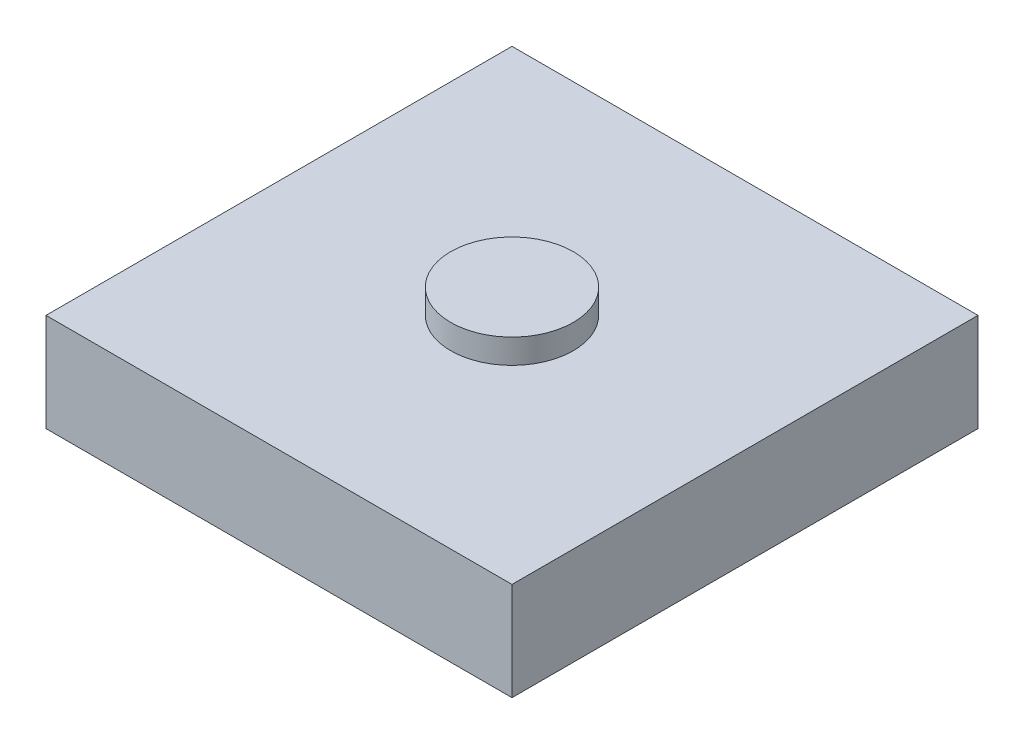
ISO-10303-21;
HEADER;
FILE_DESCRIPTION(('STEP AP214'),'2;1');
FILE_NAME('part.step','',(''),(''),'','','');
FILE_SCHEMA(('AUTOMOTIVE_DESIGN { 1 0 10303 214 1 1 1 1 }'));
ENDSEC;
DATA;
#1=APPLICATION_CONTEXT('core data for automotive mechanical design processes');
#2=APPLICATION_PROTOCOL_DEFINITION('international standard','automotive_design',2000,#1);
#3=PRODUCT_CONTEXT('',#1,'mechanical');
#4=PRODUCT('Part','Part','',(#3));
#5=PRODUCT_RELATED_PRODUCT_CATEGORY('part','',(#4));
#6=PRODUCT_DEFINITION_FORMATION('','',#4);
#7=PRODUCT_DEFINITION_CONTEXT('part definition',#1,'design');
#8=PRODUCT_DEFINITION('design','',#6,#7);
#9=PRODUCT_DEFINITION_SHAPE('','',#8);
#10=(LENGTH_UNIT() NAMED_UNIT(*) SI_UNIT(.MILLI.,.METRE.));
#11=(NAMED_UNIT(*) PLANE_ANGLE_UNIT() SI_UNIT($,.RADIAN.));
#12=(NAMED_UNIT(*) SI_UNIT($,.STERADIAN.) SOLID_ANGLE_UNIT());
#13=UNCERTAINTY_MEASURE_WITH_UNIT(LENGTH_MEASURE(1.E-05),#10,'distance_accuracy_value','');
#14=(GEOMETRIC_REPRESENTATION_CONTEXT(3) GLOBAL_UNCERTAINTY_ASSIGNED_CONTEXT((#13)) GLOBAL_UNIT_ASSIGNED_CONTEXT((#10,
#11,#12)) REPRESENTATION_CONTEXT('',''));
#15=CARTESIAN_POINT('',(0.,0.,0.));
#16=DIRECTION('',(0.,0.,1.));
#17=DIRECTION('',(1.,0.,0.));
#18=AXIS2_PLACEMENT_3D('',#15,#16,#17);
#19=CARTESIAN_POINT('',(12.065,5.08,12.065));
#20=DIRECTION('',(-1.,0.,0.));
#21=DIRECTION('',(0.,0.,1.));
#22=AXIS2_PLACEMENT_3D('',#19,#20,#21);
#23=PLANE('',#22);
#24=DIRECTION('',(0.,0.,-1.));
#25=VECTOR('',#24,1.);
#26=CARTESIAN_POINT('',(12.065,0.,12.065));
#27=LINE('',#26,#25);
#28=CARTESIAN_POINT('',(12.065,0.,12.065));
#29=VERTEX_POINT('',#28);
#30=CARTESIAN_POINT('',(12.065,0.,-12.065));
#31=VERTEX_POINT('',#30);
#32=EDGE_CURVE('E99',#29,#31,#27,.T.);
#33=ORIENTED_EDGE('',*,*,#32,.T.);
#34=DIRECTION('',(0.,-1.,0.));
#35=VECTOR('',#34,1.);
#36=CARTESIAN_POINT('',(12.065,5.08,-12.065));
#37=LINE('',#36,#35);
#38=CARTESIAN_POINT('',(12.065,5.08,-12.065));
#39=VERTEX_POINT('',#38);
#40=EDGE_CURVE('E41',#39,#31,#37,.T.);
#41=ORIENTED_EDGE('',*,*,#40,.F.);
#42=DIRECTION('',(0.,0.,-1.));
#43=VECTOR('',#42,1.);
#44=CARTESIAN_POINT('',(12.065,5.08,12.065));
#45=LINE('',#44,#43);
#46=CARTESIAN_POINT('',(12.065,5.08,12.065));
#47=VERTEX_POINT('',#46);
#48=EDGE_CURVE('E85',#47,#39,#45,.T.);
#49=ORIENTED_EDGE('',*,*,#48,.F.);
#50=DIRECTION('',(0.,-1.,0.));
#51=VECTOR('',#50,1.);
#52=CARTESIAN_POINT('',(12.065,5.08,12.065));
#53=LINE('',#52,#51);
#54=EDGE_CURVE('E95',#47,#29,#53,.T.);
#55=ORIENTED_EDGE('',*,*,#54,.T.);
#56=EDGE_LOOP('',(#33,#41,#49,#55));
#57=FACE_BOUND('',#56,.T.);
#58=ADVANCED_FACE('F33',(#57),#23,.F.);
#59=CARTESIAN_POINT('',(-12.065,5.08,-12.065));
#60=DIRECTION('',(0.,0.,1.));
#61=DIRECTION('',(1.,0.,0.));
#62=AXIS2_PLACEMENT_3D('',#59,#60,#61);
#63=PLANE('',#62);
#64=DIRECTION('',(-1.,0.,0.));
#65=VECTOR('',#64,1.);
#66=CARTESIAN_POINT('',(-12.065,0.,-12.065));
#67=LINE('',#66,#65);
#68=CARTESIAN_POINT('',(-12.065,0.,-12.065));
#69=VERTEX_POINT('',#68);
#70=EDGE_CURVE('E90',#31,#69,#67,.T.);
#71=ORIENTED_EDGE('',*,*,#70,.T.);
#72=DIRECTION('',(0.,-1.,0.));
#73=VECTOR('',#72,1.);
#74=CARTESIAN_POINT('',(-12.065,5.08,-12.065));
#75=LINE('',#74,#73);
#76=CARTESIAN_POINT('',(-12.065,5.08,-12.065));
#77=VERTEX_POINT('',#76);
#78=EDGE_CURVE('E88',#77,#69,#75,.T.);
#79=ORIENTED_EDGE('',*,*,#78,.F.);
#80=DIRECTION('',(-1.,0.,0.));
#81=VECTOR('',#80,1.);
#82=CARTESIAN_POINT('',(-12.065,5.08,-12.065));
#83=LINE('',#82,#81);
#84=EDGE_CURVE('E80',#39,#77,#83,.T.);
#85=ORIENTED_EDGE('',*,*,#84,.F.);
#86=ORIENTED_EDGE('',*,*,#40,.T.);
#87=EDGE_LOOP('',(#71,#79,#85,#86));
#88=FACE_BOUND('',#87,.T.);
#89=ADVANCED_FACE('F89',(#88),#63,.F.);
#90=CARTESIAN_POINT('',(-12.065,5.08,12.065));
#91=DIRECTION('',(1.,0.,0.));
#92=DIRECTION('',(0.,0.,-1.));
#93=AXIS2_PLACEMENT_3D('',#90,#91,#92);
#94=PLANE('',#93);
#95=DIRECTION('',(0.,0.,1.));
#96=VECTOR('',#95,1.);
#97=CARTESIAN_POINT('',(-12.065,0.,12.065));
#98=LINE('',#97,#96);
#99=CARTESIAN_POINT('',(-12.065,0.,12.065));
#100=VERTEX_POINT('',#99);
#101=EDGE_CURVE('E66',#69,#100,#98,.T.);
#102=ORIENTED_EDGE('',*,*,#101,.T.);
#103=DIRECTION('',(0.,-1.,0.));
#104=VECTOR('',#103,1.);
#105=CARTESIAN_POINT('',(-12.065,5.08,12.065));
#106=LINE('',#105,#104);
#107=CARTESIAN_POINT('',(-12.065,5.08,12.065));
#108=VERTEX_POINT('',#107);
#109=EDGE_CURVE('E91',#108,#100,#106,.T.);
#110=ORIENTED_EDGE('',*,*,#109,.F.);
#111=DIRECTION('',(0.,0.,1.));
#112=VECTOR('',#111,1.);
#113=CARTESIAN_POINT('',(-12.065,5.08,12.065));
#114=LINE('',#113,#112);
#115=EDGE_CURVE('E83',#77,#108,#114,.T.);
#116=ORIENTED_EDGE('',*,*,#115,.F.);
#117=ORIENTED_EDGE('',*,*,#78,.T.);
#118=EDGE_LOOP('',(#102,#110,#116,#117));
#119=FACE_BOUND('',#118,.T.);
#120=ADVANCED_FACE('F93',(#119),#94,.F.);
#121=CARTESIAN_POINT('',(-12.065,5.08,12.065));
#122=DIRECTION('',(0.,0.,-1.));
#123=DIRECTION('',(-1.,0.,0.));
#124=AXIS2_PLACEMENT_3D('',#121,#122,#123);
#125=PLANE('',#124);
#126=DIRECTION('',(1.,0.,0.));
#127=VECTOR('',#126,1.);
#128=CARTESIAN_POINT('',(-12.065,0.,12.065));
#129=LINE('',#128,#127);
#130=EDGE_CURVE('E72',#100,#29,#129,.T.);
#131=ORIENTED_EDGE('',*,*,#130,.T.);
#132=ORIENTED_EDGE('',*,*,#54,.F.);
#133=DIRECTION('',(1.,0.,0.));
#134=VECTOR('',#133,1.);
#135=CARTESIAN_POINT('',(-12.065,5.08,12.065));
#136=LINE('',#135,#134);
#137=EDGE_CURVE('E49',#108,#47,#136,.T.);
#138=ORIENTED_EDGE('',*,*,#137,.F.);
#139=ORIENTED_EDGE('',*,*,#109,.T.);
#140=EDGE_LOOP('',(#131,#132,#138,#139));
#141=FACE_BOUND('',#140,.T.);
#142=ADVANCED_FACE('F122',(#141),#125,.F.);
#143=CARTESIAN_POINT('',(0.,5.08,0.));
#144=DIRECTION('',(0.,-1.,0.));
#145=DIRECTION('',(0.,0.,-1.));
#146=AXIS2_PLACEMENT_3D('',#143,#144,#145);
#147=PLANE('',#146);
#148=CARTESIAN_POINT('',(0.,5.08,0.));
#149=DIRECTION('',(0.,-1.,0.));
#150=DIRECTION('',(0.,0.,-1.));
#151=AXIS2_PLACEMENT_3D('',#148,#149,#150);
#152=CIRCLE('',#151,3.175);
#153=CARTESIAN_POINT('',(0.,5.08,-3.175));
#154=VERTEX_POINT('',#153);
#155=EDGE_CURVE('E11',#154,#154,#152,.F.);
#156=ORIENTED_EDGE('',*,*,#155,.F.);
#157=EDGE_LOOP('',(#156));
#158=FACE_BOUND('',#157,.T.);
#159=ORIENTED_EDGE('',*,*,#48,.T.);
#160=ORIENTED_EDGE('',*,*,#84,.T.);
#161=ORIENTED_EDGE('',*,*,#115,.T.);
#162=ORIENTED_EDGE('',*,*,#137,.T.);
#163=EDGE_LOOP('',(#159,#160,#161,#162));
#164=FACE_BOUND('',#163,.T.);
#165=ADVANCED_FACE('F81',(#158,#164),#147,.F.);
#166=CARTESIAN_POINT('',(0.,0.,0.));
#167=DIRECTION('',(0.,-1.,0.));
#168=DIRECTION('',(0.,0.,-1.));
#169=AXIS2_PLACEMENT_3D('',#166,#167,#168);
#170=PLANE('',#169);
#171=CARTESIAN_POINT('',(0.,0.,0.));
#172=DIRECTION('',(0.,1.,0.));
#173=DIRECTION('',(0.,0.,1.));
#174=AXIS2_PLACEMENT_3D('',#171,#172,#173);
#175=CIRCLE('',#174,3.302);
#176=CARTESIAN_POINT('',(0.,0.,3.302));
#177=VERTEX_POINT('',#176);
#178=EDGE_CURVE('E180',#177,#177,#175,.T.);
#179=ORIENTED_EDGE('',*,*,#178,.T.);
#180=EDGE_LOOP('',(#179));
#181=FACE_BOUND('',#180,.T.);
#182=ORIENTED_EDGE('',*,*,#32,.F.);
#183=ORIENTED_EDGE('',*,*,#130,.F.);
#184=ORIENTED_EDGE('',*,*,#101,.F.);
#185=ORIENTED_EDGE('',*,*,#70,.F.);
#186=EDGE_LOOP('',(#182,#183,#184,#185));
#187=FACE_BOUND('',#186,.T.);
#188=ADVANCED_FACE('F110',(#181,#187),#170,.T.);
#189=CARTESIAN_POINT('',(0.,1.27,0.));
#190=DIRECTION('',(0.,-1.,0.));
#191=DIRECTION('',(0.,0.,-1.));
#192=AXIS2_PLACEMENT_3D('',#189,#190,#191);
#193=CYLINDRICAL_SURFACE('',#192,3.302);
#194=CARTESIAN_POINT('',(0.,1.27,0.));
#195=DIRECTION('',(0.,1.,0.));
#196=DIRECTION('',(0.,0.,1.));
#197=AXIS2_PLACEMENT_3D('',#194,#195,#196);
#198=CIRCLE('',#197,3.302);
#199=CARTESIAN_POINT('',(0.,1.27,3.302));
#200=VERTEX_POINT('',#199);
#201=EDGE_CURVE('E102',#200,#200,#198,.T.);
#202=ORIENTED_EDGE('',*,*,#201,.T.);
#203=EDGE_LOOP('',(#202));
#204=FACE_BOUND('',#203,.T.);
#205=ORIENTED_EDGE('',*,*,#178,.F.);
#206=EDGE_LOOP('',(#205));
#207=FACE_BOUND('',#206,.T.);
#208=ADVANCED_FACE('F112',(#204,#207),#193,.F.);
#209=CARTESIAN_POINT('',(0.,1.27,0.));
#210=DIRECTION('',(0.,1.,0.));
#211=DIRECTION('',(0.,0.,1.));
#212=AXIS2_PLACEMENT_3D('',#209,#210,#211);
#213=PLANE('',#212);
#214=ORIENTED_EDGE('',*,*,#201,.F.);
#215=EDGE_LOOP('',(#214));
#216=FACE_BOUND('',#215,.T.);
#217=ADVANCED_FACE('F119',(#216),#213,.F.);
#218=CARTESIAN_POINT('',(0.,6.35,0.));
#219=DIRECTION('',(0.,-1.,0.));
#220=DIRECTION('',(0.,0.,-1.));
#221=AXIS2_PLACEMENT_3D('',#218,#219,#220);
#222=CYLINDRICAL_SURFACE('',#221,3.175);
#223=CARTESIAN_POINT('',(0.,6.35,0.));
#224=DIRECTION('',(0.,1.,0.));
#225=DIRECTION('',(0.,0.,1.));
#226=AXIS2_PLACEMENT_3D('',#223,#224,#225);
#227=CIRCLE('',#226,3.175);
#228=CARTESIAN_POINT('',(0.,6.35,3.175));
#229=VERTEX_POINT('',#228);
#230=EDGE_CURVE('E182',#229,#229,#227,.T.);
#231=ORIENTED_EDGE('',*,*,#230,.F.);
#232=EDGE_LOOP('',(#231));
#233=FACE_BOUND('',#232,.T.);
#234=ORIENTED_EDGE('',*,*,#155,.T.);
#235=EDGE_LOOP('',(#234));
#236=FACE_BOUND('',#235,.T.);
#237=ADVANCED_FACE('F155',(#233,#236),#222,.T.);
#238=CARTESIAN_POINT('',(0.,6.35,0.));
#239=DIRECTION('',(0.,1.,0.));
#240=DIRECTION('',(0.,0.,1.));
#241=AXIS2_PLACEMENT_3D('',#238,#239,#240);
#242=PLANE('',#241);
#243=ORIENTED_EDGE('',*,*,#230,.T.);
#244=EDGE_LOOP('',(#243));
#245=FACE_BOUND('',#244,.T.);
#246=ADVANCED_FACE('F160',(#245),#242,.T.);
#247=CLOSED_SHELL('',(#58,#89,#120,#142,#165,#188,#208,#217,#237,#246));
#248=MANIFOLD_SOLID_BREP('B2',#247);
#249=ADVANCED_BREP_SHAPE_REPRESENTATION('',(#18,#248),#14);
#250=SHAPE_DEFINITION_REPRESENTATION(#9,#249);
ENDSEC;
END-ISO-10303-21;
